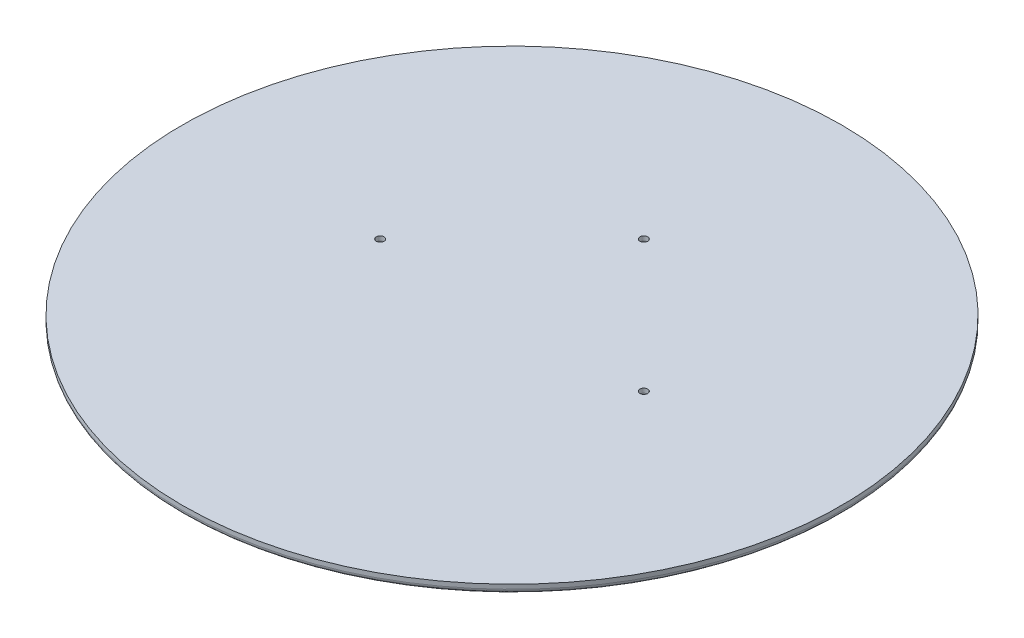
ISO-10303-21;
HEADER;
FILE_DESCRIPTION(('STEP AP214'),'2;1');
FILE_NAME('part.step','',(''),(''),'','','');
FILE_SCHEMA(('AUTOMOTIVE_DESIGN { 1 0 10303 214 1 1 1 1 }'));
ENDSEC;
DATA;
#1=APPLICATION_CONTEXT('core data for automotive mechanical design processes');
#2=APPLICATION_PROTOCOL_DEFINITION('international standard','automotive_design',2000,#1);
#3=PRODUCT_CONTEXT('',#1,'mechanical');
#4=PRODUCT('Part','Part','',(#3));
#5=PRODUCT_RELATED_PRODUCT_CATEGORY('part','',(#4));
#6=PRODUCT_DEFINITION_FORMATION('','',#4);
#7=PRODUCT_DEFINITION_CONTEXT('part definition',#1,'design');
#8=PRODUCT_DEFINITION('design','',#6,#7);
#9=PRODUCT_DEFINITION_SHAPE('','',#8);
#10=(LENGTH_UNIT() NAMED_UNIT(*) SI_UNIT(.MILLI.,.METRE.));
#11=(NAMED_UNIT(*) PLANE_ANGLE_UNIT() SI_UNIT($,.RADIAN.));
#12=(NAMED_UNIT(*) SI_UNIT($,.STERADIAN.) SOLID_ANGLE_UNIT());
#13=UNCERTAINTY_MEASURE_WITH_UNIT(LENGTH_MEASURE(1.E-05),#10,'distance_accuracy_value','');
#14=(GEOMETRIC_REPRESENTATION_CONTEXT(3) GLOBAL_UNCERTAINTY_ASSIGNED_CONTEXT((#13)) GLOBAL_UNIT_ASSIGNED_CONTEXT((#10,
#11,#12)) REPRESENTATION_CONTEXT('',''));
#15=CARTESIAN_POINT('',(0.,0.,0.));
#16=DIRECTION('',(0.,0.,1.));
#17=DIRECTION('',(1.,0.,0.));
#18=AXIS2_PLACEMENT_3D('',#15,#16,#17);
#19=CARTESIAN_POINT('',(-300.,20.,0.));
#20=DIRECTION('',(0.,-1.,0.));
#21=DIRECTION('',(0.,0.,-1.));
#22=AXIS2_PLACEMENT_3D('',#19,#20,#21);
#23=CYLINDRICAL_SURFACE('',#22,8.89000000000001);
#24=CARTESIAN_POINT('',(-300.,10.,0.));
#25=DIRECTION('',(0.,1.,0.));
#26=DIRECTION('',(0.,0.,1.));
#27=AXIS2_PLACEMENT_3D('',#24,#25,#26);
#28=CIRCLE('',#27,8.89000000000001);
#29=CARTESIAN_POINT('',(-300.,10.,8.89000000000001));
#30=VERTEX_POINT('',#29);
#31=EDGE_CURVE('E58',#30,#30,#28,.F.);
#32=ORIENTED_EDGE('',*,*,#31,.T.);
#33=EDGE_LOOP('',(#32));
#34=FACE_BOUND('',#33,.T.);
#35=CARTESIAN_POINT('',(-300.,20.,0.));
#36=DIRECTION('',(0.,1.,0.));
#37=DIRECTION('',(0.,0.,1.));
#38=AXIS2_PLACEMENT_3D('',#35,#36,#37);
#39=CIRCLE('',#38,8.89000000000001);
#40=CARTESIAN_POINT('',(-300.,20.,8.89000000000001));
#41=VERTEX_POINT('',#40);
#42=EDGE_CURVE('E93',#41,#41,#39,.T.);
#43=ORIENTED_EDGE('',*,*,#42,.T.);
#44=EDGE_LOOP('',(#43));
#45=FACE_BOUND('',#44,.T.);
#46=ADVANCED_FACE('F43',(#34,#45),#23,.F.);
#47=CARTESIAN_POINT('',(300.,20.,0.));
#48=DIRECTION('',(0.,-1.,0.));
#49=DIRECTION('',(0.,0.,-1.));
#50=AXIS2_PLACEMENT_3D('',#47,#48,#49);
#51=CYLINDRICAL_SURFACE('',#50,8.89000000000001);
#52=CARTESIAN_POINT('',(300.,10.,0.));
#53=DIRECTION('',(0.,1.,0.));
#54=DIRECTION('',(0.,0.,1.));
#55=AXIS2_PLACEMENT_3D('',#52,#53,#54);
#56=CIRCLE('',#55,8.89000000000001);
#57=CARTESIAN_POINT('',(300.,10.,8.89000000000001));
#58=VERTEX_POINT('',#57);
#59=EDGE_CURVE('E52',#58,#58,#56,.F.);
#60=ORIENTED_EDGE('',*,*,#59,.T.);
#61=EDGE_LOOP('',(#60));
#62=FACE_BOUND('',#61,.T.);
#63=CARTESIAN_POINT('',(300.,20.,0.));
#64=DIRECTION('',(0.,1.,0.));
#65=DIRECTION('',(0.,0.,1.));
#66=AXIS2_PLACEMENT_3D('',#63,#64,#65);
#67=CIRCLE('',#66,8.89000000000001);
#68=CARTESIAN_POINT('',(300.,20.,8.89000000000001));
#69=VERTEX_POINT('',#68);
#70=EDGE_CURVE('E89',#69,#69,#67,.T.);
#71=ORIENTED_EDGE('',*,*,#70,.T.);
#72=EDGE_LOOP('',(#71));
#73=FACE_BOUND('',#72,.T.);
#74=ADVANCED_FACE('F156',(#62,#73),#51,.F.);
#75=CARTESIAN_POINT('',(0.,20.,-300.));
#76=DIRECTION('',(0.,-1.,0.));
#77=DIRECTION('',(0.,0.,-1.));
#78=AXIS2_PLACEMENT_3D('',#75,#76,#77);
#79=CYLINDRICAL_SURFACE('',#78,8.89);
#80=CARTESIAN_POINT('',(0.,10.,-300.));
#81=DIRECTION('',(0.,1.,0.));
#82=DIRECTION('',(0.,0.,1.));
#83=AXIS2_PLACEMENT_3D('',#80,#81,#82);
#84=CIRCLE('',#83,8.89);
#85=CARTESIAN_POINT('',(0.,10.,-291.11));
#86=VERTEX_POINT('',#85);
#87=EDGE_CURVE('E10',#86,#86,#84,.F.);
#88=ORIENTED_EDGE('',*,*,#87,.T.);
#89=EDGE_LOOP('',(#88));
#90=FACE_BOUND('',#89,.T.);
#91=CARTESIAN_POINT('',(0.,20.,-300.));
#92=DIRECTION('',(0.,1.,0.));
#93=DIRECTION('',(0.,0.,1.));
#94=AXIS2_PLACEMENT_3D('',#91,#92,#93);
#95=CIRCLE('',#94,8.89);
#96=CARTESIAN_POINT('',(0.,20.,-291.11));
#97=VERTEX_POINT('',#96);
#98=EDGE_CURVE('E65',#97,#97,#95,.T.);
#99=ORIENTED_EDGE('',*,*,#98,.T.);
#100=EDGE_LOOP('',(#99));
#101=FACE_BOUND('',#100,.T.);
#102=ADVANCED_FACE('F161',(#90,#101),#79,.F.);
#103=CARTESIAN_POINT('',(0.,20.,0.));
#104=DIRECTION('',(0.,-1.,0.));
#105=DIRECTION('',(0.,0.,-1.));
#106=AXIS2_PLACEMENT_3D('',#103,#104,#105);
#107=CYLINDRICAL_SURFACE('',#106,750.);
#108=CARTESIAN_POINT('',(0.,10.,0.));
#109=DIRECTION('',(0.,1.,0.));
#110=DIRECTION('',(0.,0.,1.));
#111=AXIS2_PLACEMENT_3D('',#108,#109,#110);
#112=CIRCLE('',#111,750.);
#113=CARTESIAN_POINT('',(0.,10.,750.));
#114=VERTEX_POINT('',#113);
#115=EDGE_CURVE('E101',#114,#114,#112,.T.);
#116=ORIENTED_EDGE('',*,*,#115,.T.);
#117=EDGE_LOOP('',(#116));
#118=FACE_BOUND('',#117,.T.);
#119=CARTESIAN_POINT('',(0.,20.,0.));
#120=DIRECTION('',(0.,1.,0.));
#121=DIRECTION('',(0.,0.,1.));
#122=AXIS2_PLACEMENT_3D('',#119,#120,#121);
#123=CIRCLE('',#122,750.);
#124=CARTESIAN_POINT('',(0.,20.,750.));
#125=VERTEX_POINT('',#124);
#126=EDGE_CURVE('E97',#125,#125,#123,.T.);
#127=ORIENTED_EDGE('',*,*,#126,.F.);
#128=EDGE_LOOP('',(#127));
#129=FACE_BOUND('',#128,.T.);
#130=ADVANCED_FACE('F165',(#118,#129),#107,.T.);
#131=CARTESIAN_POINT('',(0.,20.,0.));
#132=DIRECTION('',(0.,1.,0.));
#133=DIRECTION('',(0.,0.,1.));
#134=AXIS2_PLACEMENT_3D('',#131,#132,#133);
#135=PLANE('',#134);
#136=ORIENTED_EDGE('',*,*,#98,.F.);
#137=EDGE_LOOP('',(#136));
#138=FACE_BOUND('',#137,.T.);
#139=ORIENTED_EDGE('',*,*,#70,.F.);
#140=EDGE_LOOP('',(#139));
#141=FACE_BOUND('',#140,.T.);
#142=ORIENTED_EDGE('',*,*,#42,.F.);
#143=EDGE_LOOP('',(#142));
#144=FACE_BOUND('',#143,.T.);
#145=ORIENTED_EDGE('',*,*,#126,.T.);
#146=EDGE_LOOP('',(#145));
#147=FACE_BOUND('',#146,.T.);
#148=ADVANCED_FACE('F137',(#138,#141,#144,#147),#135,.T.);
#149=CARTESIAN_POINT('',(0.,0.,0.));
#150=DIRECTION('',(0.,1.,0.));
#151=DIRECTION('',(0.,0.,1.));
#152=AXIS2_PLACEMENT_3D('',#149,#150,#151);
#153=PLANE('',#152);
#154=CARTESIAN_POINT('',(325.,0.,0.));
#155=DIRECTION('',(0.,1.,0.));
#156=DIRECTION('',(0.,0.,1.));
#157=AXIS2_PLACEMENT_3D('',#154,#155,#156);
#158=CIRCLE('',#157,4.99999999999999);
#159=CARTESIAN_POINT('',(325.,0.,4.99999999999999));
#160=VERTEX_POINT('',#159);
#161=EDGE_CURVE('E47',#160,#160,#158,.T.);
#162=ORIENTED_EDGE('',*,*,#161,.T.);
#163=EDGE_LOOP('',(#162));
#164=FACE_BOUND('',#163,.T.);
#165=CARTESIAN_POINT('',(-325.,0.,0.));
#166=DIRECTION('',(0.,1.,0.));
#167=DIRECTION('',(0.,0.,1.));
#168=AXIS2_PLACEMENT_3D('',#165,#166,#167);
#169=CIRCLE('',#168,4.99999999999999);
#170=CARTESIAN_POINT('',(-325.,0.,5.00000000000003));
#171=VERTEX_POINT('',#170);
#172=EDGE_CURVE('E67',#171,#171,#169,.T.);
#173=ORIENTED_EDGE('',*,*,#172,.T.);
#174=EDGE_LOOP('',(#173));
#175=FACE_BOUND('',#174,.T.);
#176=CARTESIAN_POINT('',(0.,0.,-325.));
#177=DIRECTION('',(0.,1.,0.));
#178=DIRECTION('',(0.,0.,1.));
#179=AXIS2_PLACEMENT_3D('',#176,#177,#178);
#180=CIRCLE('',#179,5.00000000000001);
#181=CARTESIAN_POINT('',(0.,0.,-320.));
#182=VERTEX_POINT('',#181);
#183=EDGE_CURVE('E62',#182,#182,#180,.T.);
#184=ORIENTED_EDGE('',*,*,#183,.T.);
#185=EDGE_LOOP('',(#184));
#186=FACE_BOUND('',#185,.T.);
#187=CARTESIAN_POINT('',(0.,0.,0.));
#188=DIRECTION('',(0.,1.,0.));
#189=DIRECTION('',(0.,0.,1.));
#190=AXIS2_PLACEMENT_3D('',#187,#188,#189);
#191=CIRCLE('',#190,740.);
#192=CARTESIAN_POINT('',(0.,0.,740.));
#193=VERTEX_POINT('',#192);
#194=EDGE_CURVE('E117',#193,#193,#191,.F.);
#195=ORIENTED_EDGE('',*,*,#194,.T.);
#196=EDGE_LOOP('',(#195));
#197=FACE_BOUND('',#196,.T.);
#198=CARTESIAN_POINT('',(-300.,0.,0.));
#199=DIRECTION('',(0.,1.,0.));
#200=DIRECTION('',(0.,0.,1.));
#201=AXIS2_PLACEMENT_3D('',#198,#199,#200);
#202=CIRCLE('',#201,18.89);
#203=CARTESIAN_POINT('',(-300.,0.,18.89));
#204=VERTEX_POINT('',#203);
#205=EDGE_CURVE('E113',#204,#204,#202,.T.);
#206=ORIENTED_EDGE('',*,*,#205,.T.);
#207=EDGE_LOOP('',(#206));
#208=FACE_BOUND('',#207,.T.);
#209=CARTESIAN_POINT('',(300.,0.,0.));
#210=DIRECTION('',(0.,1.,0.));
#211=DIRECTION('',(0.,0.,1.));
#212=AXIS2_PLACEMENT_3D('',#209,#210,#211);
#213=CIRCLE('',#212,18.89);
#214=CARTESIAN_POINT('',(300.,0.,18.89));
#215=VERTEX_POINT('',#214);
#216=EDGE_CURVE('E109',#215,#215,#213,.T.);
#217=ORIENTED_EDGE('',*,*,#216,.T.);
#218=EDGE_LOOP('',(#217));
#219=FACE_BOUND('',#218,.T.);
#220=CARTESIAN_POINT('',(0.,0.,-300.));
#221=DIRECTION('',(0.,1.,0.));
#222=DIRECTION('',(0.,0.,1.));
#223=AXIS2_PLACEMENT_3D('',#220,#221,#222);
#224=CIRCLE('',#223,18.89);
#225=CARTESIAN_POINT('',(0.,0.,-281.11));
#226=VERTEX_POINT('',#225);
#227=EDGE_CURVE('E105',#226,#226,#224,.T.);
#228=ORIENTED_EDGE('',*,*,#227,.T.);
#229=EDGE_LOOP('',(#228));
#230=FACE_BOUND('',#229,.T.);
#231=ADVANCED_FACE('F134',(#164,#175,#186,#197,#208,#219,#230),#153,.F.);
#232=CARTESIAN_POINT('',(0.,10.,0.));
#233=DIRECTION('',(0.,1.,0.));
#234=DIRECTION('',(0.,0.,1.));
#235=AXIS2_PLACEMENT_3D('',#232,#233,#234);
#236=TOROIDAL_SURFACE('',#235,740.,10.);
#237=ORIENTED_EDGE('',*,*,#194,.F.);
#238=EDGE_LOOP('',(#237));
#239=FACE_BOUND('',#238,.T.);
#240=ORIENTED_EDGE('',*,*,#115,.F.);
#241=EDGE_LOOP('',(#240));
#242=FACE_BOUND('',#241,.T.);
#243=ADVANCED_FACE('F130',(#239,#242),#236,.T.);
#244=CARTESIAN_POINT('',(-300.,10.,0.));
#245=DIRECTION('',(0.,1.,0.));
#246=DIRECTION('',(0.,0.,1.));
#247=AXIS2_PLACEMENT_3D('',#244,#245,#246);
#248=TOROIDAL_SURFACE('',#247,18.89,10.);
#249=ORIENTED_EDGE('',*,*,#31,.F.);
#250=EDGE_LOOP('',(#249));
#251=FACE_BOUND('',#250,.T.);
#252=ORIENTED_EDGE('',*,*,#205,.F.);
#253=EDGE_LOOP('',(#252));
#254=FACE_BOUND('',#253,.T.);
#255=ADVANCED_FACE('F126',(#251,#254),#248,.T.);
#256=CARTESIAN_POINT('',(300.,10.,0.));
#257=DIRECTION('',(0.,1.,0.));
#258=DIRECTION('',(0.,0.,1.));
#259=AXIS2_PLACEMENT_3D('',#256,#257,#258);
#260=TOROIDAL_SURFACE('',#259,18.89,10.);
#261=ORIENTED_EDGE('',*,*,#59,.F.);
#262=EDGE_LOOP('',(#261));
#263=FACE_BOUND('',#262,.T.);
#264=ORIENTED_EDGE('',*,*,#216,.F.);
#265=EDGE_LOOP('',(#264));
#266=FACE_BOUND('',#265,.T.);
#267=ADVANCED_FACE('F129',(#263,#266),#260,.T.);
#268=CARTESIAN_POINT('',(0.,10.,-300.));
#269=DIRECTION('',(0.,1.,0.));
#270=DIRECTION('',(0.,0.,1.));
#271=AXIS2_PLACEMENT_3D('',#268,#269,#270);
#272=TOROIDAL_SURFACE('',#271,18.89,10.);
#273=ORIENTED_EDGE('',*,*,#87,.F.);
#274=EDGE_LOOP('',(#273));
#275=FACE_BOUND('',#274,.T.);
#276=ORIENTED_EDGE('',*,*,#227,.F.);
#277=EDGE_LOOP('',(#276));
#278=FACE_BOUND('',#277,.T.);
#279=ADVANCED_FACE('F45',(#275,#278),#272,.T.);
#280=CARTESIAN_POINT('',(0.,-27.,-325.));
#281=DIRECTION('',(0.,1.,0.));
#282=DIRECTION('',(0.,0.,1.));
#283=AXIS2_PLACEMENT_3D('',#280,#281,#282);
#284=CYLINDRICAL_SURFACE('',#283,5.00000000000001);
#285=CARTESIAN_POINT('',(0.,-27.,-325.));
#286=DIRECTION('',(0.,1.,0.));
#287=DIRECTION('',(0.,0.,1.));
#288=AXIS2_PLACEMENT_3D('',#285,#286,#287);
#289=CIRCLE('',#288,5.00000000000001);
#290=CARTESIAN_POINT('',(0.,-27.,-320.));
#291=VERTEX_POINT('',#290);
#292=EDGE_CURVE('E66',#291,#291,#289,.T.);
#293=ORIENTED_EDGE('',*,*,#292,.T.);
#294=EDGE_LOOP('',(#293));
#295=FACE_BOUND('',#294,.T.);
#296=ORIENTED_EDGE('',*,*,#183,.F.);
#297=EDGE_LOOP('',(#296));
#298=FACE_BOUND('',#297,.T.);
#299=ADVANCED_FACE('F145',(#295,#298),#284,.T.);
#300=CARTESIAN_POINT('',(0.,-27.,-325.));
#301=DIRECTION('',(0.,1.,0.));
#302=DIRECTION('',(0.,0.,1.));
#303=AXIS2_PLACEMENT_3D('',#300,#301,#302);
#304=PLANE('',#303);
#305=ORIENTED_EDGE('',*,*,#292,.F.);
#306=EDGE_LOOP('',(#305));
#307=FACE_BOUND('',#306,.T.);
#308=ADVANCED_FACE('F151',(#307),#304,.F.);
#309=CARTESIAN_POINT('',(-325.,-27.,0.));
#310=DIRECTION('',(0.,1.,0.));
#311=DIRECTION('',(0.,0.,1.));
#312=AXIS2_PLACEMENT_3D('',#309,#310,#311);
#313=CYLINDRICAL_SURFACE('',#312,4.99999999999999);
#314=CARTESIAN_POINT('',(-325.,-27.,0.));
#315=DIRECTION('',(0.,1.,0.));
#316=DIRECTION('',(0.,0.,1.));
#317=AXIS2_PLACEMENT_3D('',#314,#315,#316);
#318=CIRCLE('',#317,4.99999999999999);
#319=CARTESIAN_POINT('',(-325.,-27.,5.00000000000003));
#320=VERTEX_POINT('',#319);
#321=EDGE_CURVE('E70',#320,#320,#318,.T.);
#322=ORIENTED_EDGE('',*,*,#321,.T.);
#323=EDGE_LOOP('',(#322));
#324=FACE_BOUND('',#323,.T.);
#325=ORIENTED_EDGE('',*,*,#172,.F.);
#326=EDGE_LOOP('',(#325));
#327=FACE_BOUND('',#326,.T.);
#328=ADVANCED_FACE('F192',(#324,#327),#313,.T.);
#329=CARTESIAN_POINT('',(-325.,-27.,0.));
#330=DIRECTION('',(0.,1.,0.));
#331=DIRECTION('',(0.,0.,1.));
#332=AXIS2_PLACEMENT_3D('',#329,#330,#331);
#333=PLANE('',#332);
#334=ORIENTED_EDGE('',*,*,#321,.F.);
#335=EDGE_LOOP('',(#334));
#336=FACE_BOUND('',#335,.T.);
#337=ADVANCED_FACE('F194',(#336),#333,.F.);
#338=CARTESIAN_POINT('',(325.,-27.,0.));
#339=DIRECTION('',(0.,1.,0.));
#340=DIRECTION('',(0.,0.,1.));
#341=AXIS2_PLACEMENT_3D('',#338,#339,#340);
#342=CYLINDRICAL_SURFACE('',#341,4.99999999999999);
#343=CARTESIAN_POINT('',(325.,-27.,0.));
#344=DIRECTION('',(0.,1.,0.));
#345=DIRECTION('',(0.,0.,1.));
#346=AXIS2_PLACEMENT_3D('',#343,#344,#345);
#347=CIRCLE('',#346,4.99999999999999);
#348=CARTESIAN_POINT('',(325.,-27.,4.99999999999999));
#349=VERTEX_POINT('',#348);
#350=EDGE_CURVE('E83',#349,#349,#347,.T.);
#351=ORIENTED_EDGE('',*,*,#350,.T.);
#352=EDGE_LOOP('',(#351));
#353=FACE_BOUND('',#352,.T.);
#354=ORIENTED_EDGE('',*,*,#161,.F.);
#355=EDGE_LOOP('',(#354));
#356=FACE_BOUND('',#355,.T.);
#357=ADVANCED_FACE('F197',(#353,#356),#342,.T.);
#358=CARTESIAN_POINT('',(325.,-27.,0.));
#359=DIRECTION('',(0.,1.,0.));
#360=DIRECTION('',(0.,0.,1.));
#361=AXIS2_PLACEMENT_3D('',#358,#359,#360);
#362=PLANE('',#361);
#363=ORIENTED_EDGE('',*,*,#350,.F.);
#364=EDGE_LOOP('',(#363));
#365=FACE_BOUND('',#364,.T.);
#366=ADVANCED_FACE('F201',(#365),#362,.F.);
#367=CLOSED_SHELL('',(#46,#74,#102,#130,#148,#231,#243,#255,#267,#279,#299,#308,#328,#337,#357,#366));
#368=MANIFOLD_SOLID_BREP('B2',#367);
#369=ADVANCED_BREP_SHAPE_REPRESENTATION('',(#18,#368),#14);
#370=SHAPE_DEFINITION_REPRESENTATION(#9,#369);
ENDSEC;
END-ISO-10303-21;
